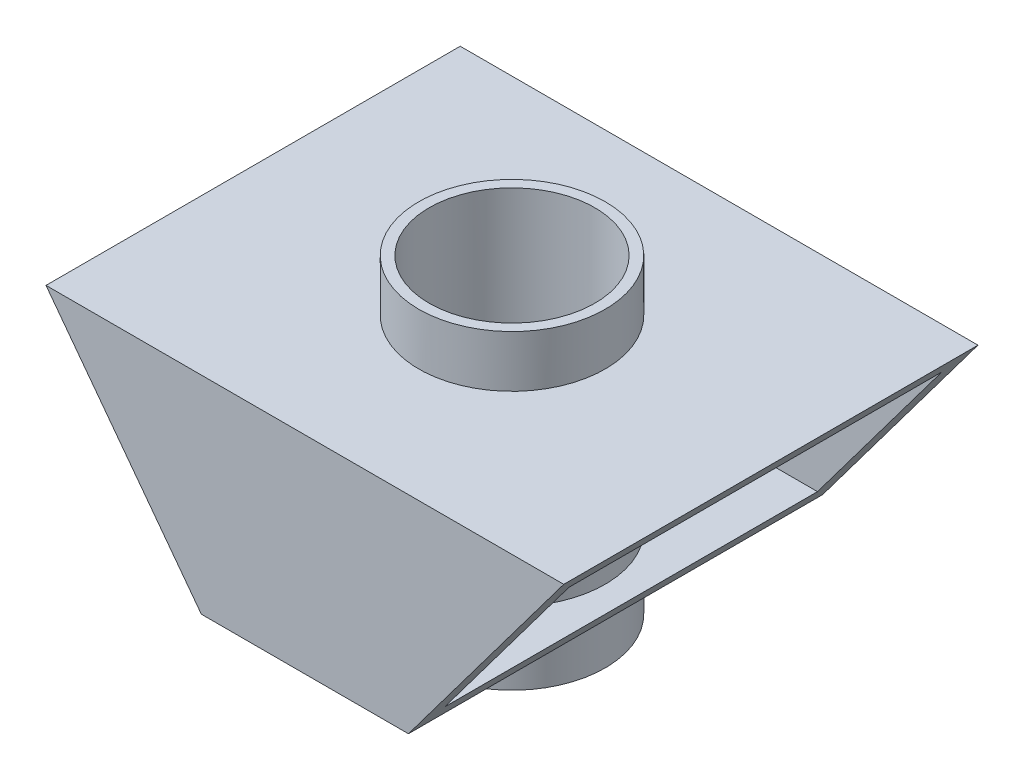
ISO-10303-21;
HEADER;
FILE_DESCRIPTION(('STEP AP214'),'2;1');
FILE_NAME('part.step','',(''),(''),'','','');
FILE_SCHEMA(('AUTOMOTIVE_DESIGN { 1 0 10303 214 1 1 1 1 }'));
ENDSEC;
DATA;
#1=APPLICATION_CONTEXT('core data for automotive mechanical design processes');
#2=APPLICATION_PROTOCOL_DEFINITION('international standard','automotive_design',2000,#1);
#3=PRODUCT_CONTEXT('',#1,'mechanical');
#4=PRODUCT('Part','Part','',(#3));
#5=PRODUCT_RELATED_PRODUCT_CATEGORY('part','',(#4));
#6=PRODUCT_DEFINITION_FORMATION('','',#4);
#7=PRODUCT_DEFINITION_CONTEXT('part definition',#1,'design');
#8=PRODUCT_DEFINITION('design','',#6,#7);
#9=PRODUCT_DEFINITION_SHAPE('','',#8);
#10=(LENGTH_UNIT() NAMED_UNIT(*) SI_UNIT(.MILLI.,.METRE.));
#11=(NAMED_UNIT(*) PLANE_ANGLE_UNIT() SI_UNIT($,.RADIAN.));
#12=(NAMED_UNIT(*) SI_UNIT($,.STERADIAN.) SOLID_ANGLE_UNIT());
#13=UNCERTAINTY_MEASURE_WITH_UNIT(LENGTH_MEASURE(1.E-05),#10,'distance_accuracy_value','');
#14=(GEOMETRIC_REPRESENTATION_CONTEXT(3) GLOBAL_UNCERTAINTY_ASSIGNED_CONTEXT((#13)) GLOBAL_UNIT_ASSIGNED_CONTEXT((#10,
#11,#12)) REPRESENTATION_CONTEXT('',''));
#15=CARTESIAN_POINT('',(0.,0.,0.));
#16=DIRECTION('',(0.,0.,1.));
#17=DIRECTION('',(1.,0.,0.));
#18=AXIS2_PLACEMENT_3D('',#15,#16,#17);
#19=CARTESIAN_POINT('',(-64.3954312071844,0.,-18.));
#20=DIRECTION('',(0.,0.,-1.));
#21=DIRECTION('',(-1.,0.,0.));
#22=AXIS2_PLACEMENT_3D('',#19,#20,#21);
#23=PLANE('',#22);
#24=DIRECTION('',(-0.6,-0.8,0.));
#25=VECTOR('',#24,1.);
#26=CARTESIAN_POINT('',(-16.7823552345864,-35.7098069794485,-18.));
#27=LINE('',#26,#25);
#28=CARTESIAN_POINT('',(23.5,18.,-18.));
#29=VERTEX_POINT('',#28);
#30=CARTESIAN_POINT('',(11.5,2.,-18.));
#31=VERTEX_POINT('',#30);
#32=EDGE_CURVE('E151',#29,#31,#27,.T.);
#33=ORIENTED_EDGE('',*,*,#32,.F.);
#34=DIRECTION('',(1.,0.,0.));
#35=VECTOR('',#34,1.);
#36=CARTESIAN_POINT('',(-64.3954312071844,18.,-18.));
#37=LINE('',#36,#35);
#38=CARTESIAN_POINT('',(-23.5,18.,-18.));
#39=VERTEX_POINT('',#38);
#40=EDGE_CURVE('E208',#39,#29,#37,.T.);
#41=ORIENTED_EDGE('',*,*,#40,.F.);
#42=DIRECTION('',(0.6,-0.8,0.));
#43=VECTOR('',#42,1.);
#44=CARTESIAN_POINT('',(-29.5823552345864,26.1098069794485,-18.));
#45=LINE('',#44,#43);
#46=CARTESIAN_POINT('',(-11.5,2.,-18.));
#47=VERTEX_POINT('',#46);
#48=EDGE_CURVE('E142',#39,#47,#45,.T.);
#49=ORIENTED_EDGE('',*,*,#48,.T.);
#50=DIRECTION('',(1.,0.,0.));
#51=VECTOR('',#50,1.);
#52=CARTESIAN_POINT('',(-64.3954312071844,2.,-18.));
#53=LINE('',#52,#51);
#54=EDGE_CURVE('E200',#47,#31,#53,.T.);
#55=ORIENTED_EDGE('',*,*,#54,.T.);
#56=EDGE_LOOP('',(#33,#41,#49,#55));
#57=FACE_BOUND('',#56,.T.);
#58=ADVANCED_FACE('F41',(#57),#23,.F.);
#59=CARTESIAN_POINT('',(-64.3954312071844,18.,0.));
#60=DIRECTION('',(0.,1.,0.));
#61=DIRECTION('',(0.,0.,1.));
#62=AXIS2_PLACEMENT_3D('',#59,#60,#61);
#63=PLANE('',#62);
#64=CARTESIAN_POINT('',(0.,18.,0.));
#65=DIRECTION('',(0.,1.,0.));
#66=DIRECTION('',(0.,0.,1.));
#67=AXIS2_PLACEMENT_3D('',#64,#65,#66);
#68=CIRCLE('',#67,9.);
#69=CARTESIAN_POINT('',(0.,18.,9.));
#70=VERTEX_POINT('',#69);
#71=EDGE_CURVE('E12',#70,#70,#68,.F.);
#72=ORIENTED_EDGE('',*,*,#71,.F.);
#73=EDGE_LOOP('',(#72));
#74=FACE_BOUND('',#73,.T.);
#75=DIRECTION('',(0.,0.,-1.));
#76=VECTOR('',#75,1.);
#77=CARTESIAN_POINT('',(23.5,18.,0.));
#78=LINE('',#77,#76);
#79=CARTESIAN_POINT('',(23.5,18.,18.));
#80=VERTEX_POINT('',#79);
#81=EDGE_CURVE('E191',#80,#29,#78,.T.);
#82=ORIENTED_EDGE('',*,*,#81,.F.);
#83=DIRECTION('',(1.,0.,0.));
#84=VECTOR('',#83,1.);
#85=CARTESIAN_POINT('',(-64.3954312071844,18.,18.));
#86=LINE('',#85,#84);
#87=CARTESIAN_POINT('',(-23.5,18.,18.));
#88=VERTEX_POINT('',#87);
#89=EDGE_CURVE('E204',#88,#80,#86,.T.);
#90=ORIENTED_EDGE('',*,*,#89,.F.);
#91=DIRECTION('',(0.,0.,-1.));
#92=VECTOR('',#91,1.);
#93=CARTESIAN_POINT('',(-23.5,18.,0.));
#94=LINE('',#93,#92);
#95=EDGE_CURVE('E169',#88,#39,#94,.T.);
#96=ORIENTED_EDGE('',*,*,#95,.T.);
#97=ORIENTED_EDGE('',*,*,#40,.T.);
#98=EDGE_LOOP('',(#82,#90,#96,#97));
#99=FACE_BOUND('',#98,.T.);
#100=ADVANCED_FACE('F225',(#74,#99),#63,.F.);
#101=CARTESIAN_POINT('',(-64.3954312071844,0.,18.));
#102=DIRECTION('',(0.,0.,1.));
#103=DIRECTION('',(1.,0.,0.));
#104=AXIS2_PLACEMENT_3D('',#101,#102,#103);
#105=PLANE('',#104);
#106=DIRECTION('',(0.6,0.8,0.));
#107=VECTOR('',#106,1.);
#108=CARTESIAN_POINT('',(-16.7823552345864,-35.7098069794485,18.));
#109=LINE('',#108,#107);
#110=CARTESIAN_POINT('',(11.5,2.,18.));
#111=VERTEX_POINT('',#110);
#112=EDGE_CURVE('E194',#111,#80,#109,.T.);
#113=ORIENTED_EDGE('',*,*,#112,.F.);
#114=DIRECTION('',(1.,0.,0.));
#115=VECTOR('',#114,1.);
#116=CARTESIAN_POINT('',(-64.3954312071844,2.,18.));
#117=LINE('',#116,#115);
#118=CARTESIAN_POINT('',(-11.5,1.99999999999999,18.));
#119=VERTEX_POINT('',#118);
#120=EDGE_CURVE('E145',#119,#111,#117,.T.);
#121=ORIENTED_EDGE('',*,*,#120,.F.);
#122=DIRECTION('',(-0.6,0.8,0.));
#123=VECTOR('',#122,1.);
#124=CARTESIAN_POINT('',(-29.5823552345864,26.1098069794485,18.));
#125=LINE('',#124,#123);
#126=EDGE_CURVE('E183',#119,#88,#125,.T.);
#127=ORIENTED_EDGE('',*,*,#126,.T.);
#128=ORIENTED_EDGE('',*,*,#89,.T.);
#129=EDGE_LOOP('',(#113,#121,#127,#128));
#130=FACE_BOUND('',#129,.T.);
#131=ADVANCED_FACE('F222',(#130),#105,.F.);
#132=CARTESIAN_POINT('',(-64.3954312071844,2.,0.));
#133=DIRECTION('',(0.,-1.,0.));
#134=DIRECTION('',(0.,0.,-1.));
#135=AXIS2_PLACEMENT_3D('',#132,#133,#134);
#136=PLANE('',#135);
#137=CARTESIAN_POINT('',(0.,2.,0.));
#138=DIRECTION('',(0.,-1.,0.));
#139=DIRECTION('',(0.,0.,-1.));
#140=AXIS2_PLACEMENT_3D('',#137,#138,#139);
#141=CIRCLE('',#140,9.);
#142=CARTESIAN_POINT('',(0.,2.,-9.));
#143=VERTEX_POINT('',#142);
#144=EDGE_CURVE('E51',#143,#143,#141,.F.);
#145=ORIENTED_EDGE('',*,*,#144,.F.);
#146=EDGE_LOOP('',(#145));
#147=FACE_BOUND('',#146,.T.);
#148=DIRECTION('',(0.,0.,1.));
#149=VECTOR('',#148,1.);
#150=CARTESIAN_POINT('',(11.5,2.,0.));
#151=LINE('',#150,#149);
#152=EDGE_CURVE('E197',#31,#111,#151,.T.);
#153=ORIENTED_EDGE('',*,*,#152,.F.);
#154=ORIENTED_EDGE('',*,*,#54,.F.);
#155=DIRECTION('',(0.,0.,1.));
#156=VECTOR('',#155,1.);
#157=CARTESIAN_POINT('',(-11.5,2.,0.));
#158=LINE('',#157,#156);
#159=EDGE_CURVE('E187',#47,#119,#158,.T.);
#160=ORIENTED_EDGE('',*,*,#159,.T.);
#161=ORIENTED_EDGE('',*,*,#120,.T.);
#162=EDGE_LOOP('',(#153,#154,#160,#161));
#163=FACE_BOUND('',#162,.T.);
#164=ADVANCED_FACE('F217',(#147,#163),#136,.F.);
#165=CARTESIAN_POINT('',(-10.,0.,-45.));
#166=DIRECTION('',(0.8,0.6,0.));
#167=DIRECTION('',(-0.6,0.8,0.));
#168=AXIS2_PLACEMENT_3D('',#165,#166,#167);
#169=PLANE('',#168);
#170=DIRECTION('',(0.6,-0.8,0.));
#171=VECTOR('',#170,1.);
#172=CARTESIAN_POINT('',(-10.,0.,-20.));
#173=LINE('',#172,#171);
#174=CARTESIAN_POINT('',(-25.,20.,-20.));
#175=VERTEX_POINT('',#174);
#176=CARTESIAN_POINT('',(-10.,0.,-20.));
#177=VERTEX_POINT('',#176);
#178=EDGE_CURVE('E67',#175,#177,#173,.T.);
#179=ORIENTED_EDGE('',*,*,#178,.T.);
#180=DIRECTION('',(0.,0.,1.));
#181=VECTOR('',#180,1.);
#182=CARTESIAN_POINT('',(-10.,0.,-45.));
#183=LINE('',#182,#181);
#184=CARTESIAN_POINT('',(-10.,0.,20.));
#185=VERTEX_POINT('',#184);
#186=EDGE_CURVE('E175',#177,#185,#183,.T.);
#187=ORIENTED_EDGE('',*,*,#186,.T.);
#188=DIRECTION('',(-0.6,0.8,0.));
#189=VECTOR('',#188,1.);
#190=CARTESIAN_POINT('',(-10.,0.,20.));
#191=LINE('',#190,#189);
#192=CARTESIAN_POINT('',(-25.,20.,20.));
#193=VERTEX_POINT('',#192);
#194=EDGE_CURVE('E129',#185,#193,#191,.T.);
#195=ORIENTED_EDGE('',*,*,#194,.T.);
#196=DIRECTION('',(0.,0.,1.));
#197=VECTOR('',#196,1.);
#198=CARTESIAN_POINT('',(-25.,20.,20.));
#199=LINE('',#198,#197);
#200=EDGE_CURVE('E132',#175,#193,#199,.T.);
#201=ORIENTED_EDGE('',*,*,#200,.F.);
#202=EDGE_LOOP('',(#179,#187,#195,#201));
#203=FACE_BOUND('',#202,.T.);
#204=ORIENTED_EDGE('',*,*,#48,.F.);
#205=ORIENTED_EDGE('',*,*,#95,.F.);
#206=ORIENTED_EDGE('',*,*,#126,.F.);
#207=ORIENTED_EDGE('',*,*,#159,.F.);
#208=EDGE_LOOP('',(#204,#205,#206,#207));
#209=FACE_BOUND('',#208,.T.);
#210=ADVANCED_FACE('F227',(#203,#209),#169,.F.);
#211=CARTESIAN_POINT('',(6.4,-4.8,-45.));
#212=DIRECTION('',(0.8,-0.6,0.));
#213=DIRECTION('',(0.6,0.8,0.));
#214=AXIS2_PLACEMENT_3D('',#211,#212,#213);
#215=PLANE('',#214);
#216=DIRECTION('',(0.,0.,-1.));
#217=VECTOR('',#216,1.);
#218=CARTESIAN_POINT('',(25.,20.,20.));
#219=LINE('',#218,#217);
#220=CARTESIAN_POINT('',(25.,20.,20.));
#221=VERTEX_POINT('',#220);
#222=CARTESIAN_POINT('',(25.,20.,-20.));
#223=VERTEX_POINT('',#222);
#224=EDGE_CURVE('E107',#221,#223,#219,.T.);
#225=ORIENTED_EDGE('',*,*,#224,.F.);
#226=DIRECTION('',(0.6,0.8,0.));
#227=VECTOR('',#226,1.);
#228=CARTESIAN_POINT('',(6.4,-4.8,20.));
#229=LINE('',#228,#227);
#230=CARTESIAN_POINT('',(10.,0.,20.));
#231=VERTEX_POINT('',#230);
#232=EDGE_CURVE('E59',#231,#221,#229,.T.);
#233=ORIENTED_EDGE('',*,*,#232,.F.);
#234=DIRECTION('',(0.,0.,1.));
#235=VECTOR('',#234,1.);
#236=CARTESIAN_POINT('',(10.,0.,-45.));
#237=LINE('',#236,#235);
#238=CARTESIAN_POINT('',(10.,0.,-20.));
#239=VERTEX_POINT('',#238);
#240=EDGE_CURVE('E128',#239,#231,#237,.T.);
#241=ORIENTED_EDGE('',*,*,#240,.F.);
#242=DIRECTION('',(-0.6,-0.8,0.));
#243=VECTOR('',#242,1.);
#244=CARTESIAN_POINT('',(6.4,-4.8,-20.));
#245=LINE('',#244,#243);
#246=EDGE_CURVE('E111',#223,#239,#245,.T.);
#247=ORIENTED_EDGE('',*,*,#246,.F.);
#248=EDGE_LOOP('',(#225,#233,#241,#247));
#249=FACE_BOUND('',#248,.T.);
#250=ORIENTED_EDGE('',*,*,#152,.T.);
#251=ORIENTED_EDGE('',*,*,#112,.T.);
#252=ORIENTED_EDGE('',*,*,#81,.T.);
#253=ORIENTED_EDGE('',*,*,#32,.T.);
#254=EDGE_LOOP('',(#250,#251,#252,#253));
#255=FACE_BOUND('',#254,.T.);
#256=ADVANCED_FACE('F108',(#249,#255),#215,.T.);
#257=CARTESIAN_POINT('',(-25.,20.,20.));
#258=DIRECTION('',(0.,0.,-1.));
#259=DIRECTION('',(-1.,0.,0.));
#260=AXIS2_PLACEMENT_3D('',#257,#258,#259);
#261=PLANE('',#260);
#262=ORIENTED_EDGE('',*,*,#232,.T.);
#263=DIRECTION('',(1.,0.,0.));
#264=VECTOR('',#263,1.);
#265=CARTESIAN_POINT('',(-25.,20.,20.));
#266=LINE('',#265,#264);
#267=EDGE_CURVE('E118',#193,#221,#266,.T.);
#268=ORIENTED_EDGE('',*,*,#267,.F.);
#269=ORIENTED_EDGE('',*,*,#194,.F.);
#270=DIRECTION('',(1.,0.,0.));
#271=VECTOR('',#270,1.);
#272=CARTESIAN_POINT('',(-25.,0.,20.));
#273=LINE('',#272,#271);
#274=EDGE_CURVE('E126',#185,#231,#273,.T.);
#275=ORIENTED_EDGE('',*,*,#274,.T.);
#276=EDGE_LOOP('',(#262,#268,#269,#275));
#277=FACE_BOUND('',#276,.T.);
#278=ADVANCED_FACE('F43',(#277),#261,.F.);
#279=CARTESIAN_POINT('',(-25.,20.,-20.));
#280=DIRECTION('',(0.,0.,1.));
#281=DIRECTION('',(1.,0.,0.));
#282=AXIS2_PLACEMENT_3D('',#279,#280,#281);
#283=PLANE('',#282);
#284=ORIENTED_EDGE('',*,*,#246,.T.);
#285=DIRECTION('',(-1.,0.,0.));
#286=VECTOR('',#285,1.);
#287=CARTESIAN_POINT('',(-25.,0.,-20.));
#288=LINE('',#287,#286);
#289=EDGE_CURVE('E136',#239,#177,#288,.T.);
#290=ORIENTED_EDGE('',*,*,#289,.T.);
#291=ORIENTED_EDGE('',*,*,#178,.F.);
#292=DIRECTION('',(-1.,0.,0.));
#293=VECTOR('',#292,1.);
#294=CARTESIAN_POINT('',(-25.,20.,-20.));
#295=LINE('',#294,#293);
#296=EDGE_CURVE('E117',#223,#175,#295,.T.);
#297=ORIENTED_EDGE('',*,*,#296,.F.);
#298=EDGE_LOOP('',(#284,#290,#291,#297));
#299=FACE_BOUND('',#298,.T.);
#300=ADVANCED_FACE('F252',(#299),#283,.F.);
#301=CARTESIAN_POINT('',(0.,0.,0.));
#302=DIRECTION('',(0.,-1.,0.));
#303=DIRECTION('',(0.,0.,-1.));
#304=AXIS2_PLACEMENT_3D('',#301,#302,#303);
#305=PLANE('',#304);
#306=CARTESIAN_POINT('',(0.,0.,0.));
#307=DIRECTION('',(0.,-1.,0.));
#308=DIRECTION('',(0.,0.,-1.));
#309=AXIS2_PLACEMENT_3D('',#306,#307,#308);
#310=CIRCLE('',#309,9.);
#311=CARTESIAN_POINT('',(0.,0.,-9.));
#312=VERTEX_POINT('',#311);
#313=EDGE_CURVE('E165',#312,#312,#310,.F.);
#314=ORIENTED_EDGE('',*,*,#313,.T.);
#315=EDGE_LOOP('',(#314));
#316=FACE_BOUND('',#315,.T.);
#317=ORIENTED_EDGE('',*,*,#289,.F.);
#318=ORIENTED_EDGE('',*,*,#240,.T.);
#319=ORIENTED_EDGE('',*,*,#274,.F.);
#320=ORIENTED_EDGE('',*,*,#186,.F.);
#321=EDGE_LOOP('',(#317,#318,#319,#320));
#322=FACE_BOUND('',#321,.T.);
#323=ADVANCED_FACE('F249',(#316,#322),#305,.T.);
#324=CARTESIAN_POINT('',(0.,20.,0.));
#325=DIRECTION('',(0.,-1.,0.));
#326=DIRECTION('',(0.,0.,-1.));
#327=AXIS2_PLACEMENT_3D('',#324,#325,#326);
#328=PLANE('',#327);
#329=CARTESIAN_POINT('',(0.,20.,0.));
#330=DIRECTION('',(0.,-1.,0.));
#331=DIRECTION('',(0.,0.,-1.));
#332=AXIS2_PLACEMENT_3D('',#329,#330,#331);
#333=CIRCLE('',#332,9.);
#334=CARTESIAN_POINT('',(0.,20.,-9.));
#335=VERTEX_POINT('',#334);
#336=EDGE_CURVE('E45',#335,#335,#333,.F.);
#337=ORIENTED_EDGE('',*,*,#336,.F.);
#338=EDGE_LOOP('',(#337));
#339=FACE_BOUND('',#338,.T.);
#340=ORIENTED_EDGE('',*,*,#200,.T.);
#341=ORIENTED_EDGE('',*,*,#267,.T.);
#342=ORIENTED_EDGE('',*,*,#224,.T.);
#343=ORIENTED_EDGE('',*,*,#296,.T.);
#344=EDGE_LOOP('',(#340,#341,#342,#343));
#345=FACE_BOUND('',#344,.T.);
#346=ADVANCED_FACE('F131',(#339,#345),#328,.F.);
#347=CARTESIAN_POINT('',(0.,25.,0.));
#348=DIRECTION('',(0.,1.,0.));
#349=DIRECTION('',(0.,0.,1.));
#350=AXIS2_PLACEMENT_3D('',#347,#348,#349);
#351=PLANE('',#350);
#352=CARTESIAN_POINT('',(0.,25.,0.));
#353=DIRECTION('',(0.,1.,0.));
#354=DIRECTION('',(0.,0.,1.));
#355=AXIS2_PLACEMENT_3D('',#352,#353,#354);
#356=CIRCLE('',#355,8.);
#357=CARTESIAN_POINT('',(0.,25.,8.));
#358=VERTEX_POINT('',#357);
#359=EDGE_CURVE('E371',#358,#358,#356,.T.);
#360=ORIENTED_EDGE('',*,*,#359,.F.);
#361=EDGE_LOOP('',(#360));
#362=FACE_BOUND('',#361,.T.);
#363=CARTESIAN_POINT('',(0.,25.,0.));
#364=DIRECTION('',(0.,1.,0.));
#365=DIRECTION('',(0.,0.,1.));
#366=AXIS2_PLACEMENT_3D('',#363,#364,#365);
#367=CIRCLE('',#366,9.);
#368=CARTESIAN_POINT('',(0.,25.,9.));
#369=VERTEX_POINT('',#368);
#370=EDGE_CURVE('E381',#369,#369,#367,.T.);
#371=ORIENTED_EDGE('',*,*,#370,.T.);
#372=EDGE_LOOP('',(#371));
#373=FACE_BOUND('',#372,.T.);
#374=ADVANCED_FACE('F248',(#362,#373),#351,.T.);
#375=CARTESIAN_POINT('',(0.,25.,0.));
#376=DIRECTION('',(0.,-1.,0.));
#377=DIRECTION('',(0.,0.,-1.));
#378=AXIS2_PLACEMENT_3D('',#375,#376,#377);
#379=CYLINDRICAL_SURFACE('',#378,9.);
#380=ORIENTED_EDGE('',*,*,#370,.F.);
#381=EDGE_LOOP('',(#380));
#382=FACE_BOUND('',#381,.T.);
#383=ORIENTED_EDGE('',*,*,#336,.T.);
#384=EDGE_LOOP('',(#383));
#385=FACE_BOUND('',#384,.T.);
#386=ADVANCED_FACE('F315',(#382,#385),#379,.T.);
#387=CARTESIAN_POINT('',(0.,-5.,0.));
#388=DIRECTION('',(0.,-1.,0.));
#389=DIRECTION('',(0.,0.,-1.));
#390=AXIS2_PLACEMENT_3D('',#387,#388,#389);
#391=PLANE('',#390);
#392=CARTESIAN_POINT('',(0.,-5.,0.));
#393=DIRECTION('',(0.,-1.,0.));
#394=DIRECTION('',(0.,0.,-1.));
#395=AXIS2_PLACEMENT_3D('',#392,#393,#394);
#396=CIRCLE('',#395,8.);
#397=CARTESIAN_POINT('',(0.,-5.,-8.));
#398=VERTEX_POINT('',#397);
#399=EDGE_CURVE('E374',#398,#398,#396,.F.);
#400=ORIENTED_EDGE('',*,*,#399,.T.);
#401=EDGE_LOOP('',(#400));
#402=FACE_BOUND('',#401,.T.);
#403=CARTESIAN_POINT('',(0.,-5.,0.));
#404=DIRECTION('',(0.,-1.,0.));
#405=DIRECTION('',(0.,0.,-1.));
#406=AXIS2_PLACEMENT_3D('',#403,#404,#405);
#407=CIRCLE('',#406,9.);
#408=CARTESIAN_POINT('',(0.,-5.,-9.));
#409=VERTEX_POINT('',#408);
#410=EDGE_CURVE('E376',#409,#409,#407,.F.);
#411=ORIENTED_EDGE('',*,*,#410,.F.);
#412=EDGE_LOOP('',(#411));
#413=FACE_BOUND('',#412,.T.);
#414=ADVANCED_FACE('F320',(#402,#413),#391,.T.);
#415=ORIENTED_EDGE('',*,*,#313,.F.);
#416=EDGE_LOOP('',(#415));
#417=FACE_BOUND('',#416,.T.);
#418=ORIENTED_EDGE('',*,*,#410,.T.);
#419=EDGE_LOOP('',(#418));
#420=FACE_BOUND('',#419,.T.);
#421=ADVANCED_FACE('F323',(#417,#420),#379,.T.);
#422=ORIENTED_EDGE('',*,*,#144,.T.);
#423=EDGE_LOOP('',(#422));
#424=FACE_BOUND('',#423,.T.);
#425=ORIENTED_EDGE('',*,*,#71,.T.);
#426=EDGE_LOOP('',(#425));
#427=FACE_BOUND('',#426,.T.);
#428=ADVANCED_FACE('F324',(#424,#427),#379,.T.);
#429=CARTESIAN_POINT('',(0.,-27.6274169979695,0.));
#430=DIRECTION('',(0.,1.,0.));
#431=DIRECTION('',(0.,0.,1.));
#432=AXIS2_PLACEMENT_3D('',#429,#430,#431);
#433=CYLINDRICAL_SURFACE('',#432,8.);
#434=ORIENTED_EDGE('',*,*,#359,.T.);
#435=EDGE_LOOP('',(#434));
#436=FACE_BOUND('',#435,.T.);
#437=ORIENTED_EDGE('',*,*,#399,.F.);
#438=EDGE_LOOP('',(#437));
#439=FACE_BOUND('',#438,.T.);
#440=ADVANCED_FACE('F342',(#436,#439),#433,.F.);
#441=CLOSED_SHELL('',(#58,#100,#131,#164,#210,#256,#278,#300,#323,#346,#374,#386,#414,#421,#428,#440));
#442=MANIFOLD_SOLID_BREP('B2',#441);
#443=ADVANCED_BREP_SHAPE_REPRESENTATION('',(#18,#442),#14);
#444=SHAPE_DEFINITION_REPRESENTATION(#9,#443);
ENDSEC;
END-ISO-10303-21;
